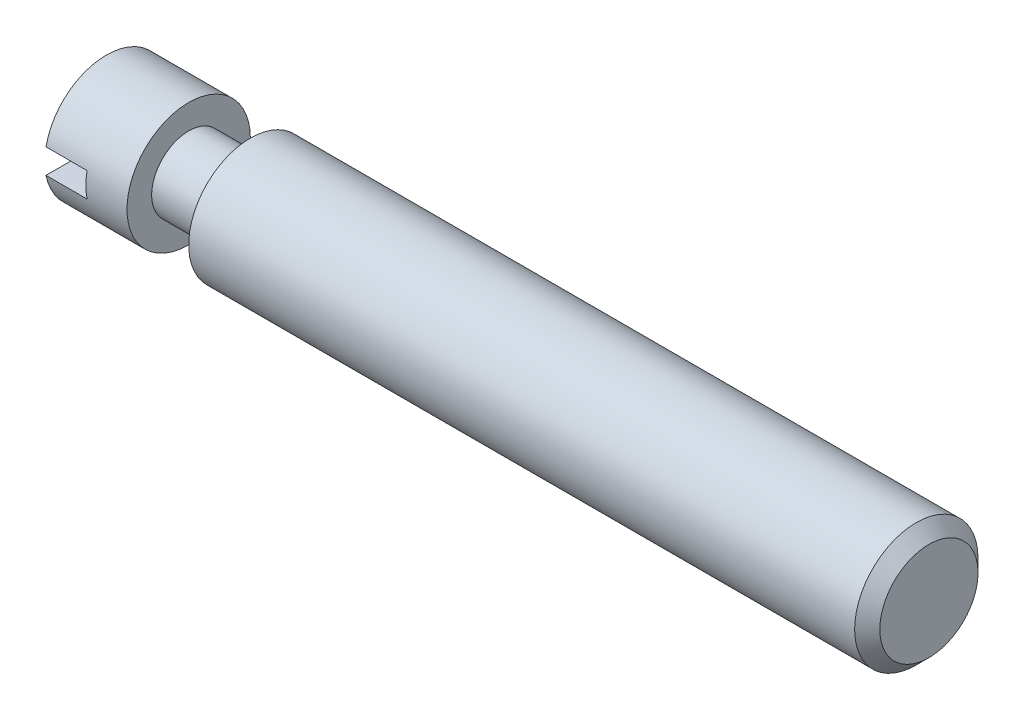
ISO-10303-21;
HEADER;
FILE_DESCRIPTION(('STEP AP214'),'2;1');
FILE_NAME('part.step','',(''),(''),'','','');
FILE_SCHEMA(('AUTOMOTIVE_DESIGN { 1 0 10303 214 1 1 1 1 }'));
ENDSEC;
DATA;
#1=APPLICATION_CONTEXT('core data for automotive mechanical design processes');
#2=APPLICATION_PROTOCOL_DEFINITION('international standard','automotive_design',2000,#1);
#3=PRODUCT_CONTEXT('',#1,'mechanical');
#4=PRODUCT('Part','Part','',(#3));
#5=PRODUCT_RELATED_PRODUCT_CATEGORY('part','',(#4));
#6=PRODUCT_DEFINITION_FORMATION('','',#4);
#7=PRODUCT_DEFINITION_CONTEXT('part definition',#1,'design');
#8=PRODUCT_DEFINITION('design','',#6,#7);
#9=PRODUCT_DEFINITION_SHAPE('','',#8);
#10=(LENGTH_UNIT() NAMED_UNIT(*) SI_UNIT(.MILLI.,.METRE.));
#11=(NAMED_UNIT(*) PLANE_ANGLE_UNIT() SI_UNIT($,.RADIAN.));
#12=(NAMED_UNIT(*) SI_UNIT($,.STERADIAN.) SOLID_ANGLE_UNIT());
#13=UNCERTAINTY_MEASURE_WITH_UNIT(LENGTH_MEASURE(1.E-05),#10,'distance_accuracy_value','');
#14=(GEOMETRIC_REPRESENTATION_CONTEXT(3) GLOBAL_UNCERTAINTY_ASSIGNED_CONTEXT((#13)) GLOBAL_UNIT_ASSIGNED_CONTEXT((#10,
#11,#12)) REPRESENTATION_CONTEXT('',''));
#15=CARTESIAN_POINT('',(0.,0.,0.));
#16=DIRECTION('',(0.,0.,1.));
#17=DIRECTION('',(1.,0.,0.));
#18=AXIS2_PLACEMENT_3D('',#15,#16,#17);
#19=CARTESIAN_POINT('',(2.,-0.6,3.));
#20=DIRECTION('',(1.,0.,0.));
#21=DIRECTION('',(0.,0.,-1.));
#22=AXIS2_PLACEMENT_3D('',#19,#20,#21);
#23=PLANE('',#22);
#24=DIRECTION('',(0.,0.,-1.));
#25=VECTOR('',#24,1.);
#26=CARTESIAN_POINT('',(2.,-0.6,3.));
#27=LINE('',#26,#25);
#28=CARTESIAN_POINT('',(2.,-0.6,-2.93938769133981));
#29=VERTEX_POINT('',#28);
#30=CARTESIAN_POINT('',(2.,-0.6,2.93938769133981));
#31=VERTEX_POINT('',#30);
#32=EDGE_CURVE('E60',#29,#31,#27,.F.);
#33=ORIENTED_EDGE('',*,*,#32,.T.);
#34=CARTESIAN_POINT('',(2.,0.,0.));
#35=DIRECTION('',(1.,0.,0.));
#36=DIRECTION('',(0.,0.,-1.));
#37=AXIS2_PLACEMENT_3D('',#34,#35,#36);
#38=CIRCLE('',#37,3.);
#39=CARTESIAN_POINT('',(2.,0.6,2.93938769133981));
#40=VERTEX_POINT('',#39);
#41=EDGE_CURVE('E19',#40,#31,#38,.T.);
#42=ORIENTED_EDGE('',*,*,#41,.F.);
#43=DIRECTION('',(0.,0.,1.));
#44=VECTOR('',#43,1.);
#45=CARTESIAN_POINT('',(2.,0.6,3.));
#46=LINE('',#45,#44);
#47=CARTESIAN_POINT('',(2.,0.600000000000001,-2.93938769133981));
#48=VERTEX_POINT('',#47);
#49=EDGE_CURVE('E57',#40,#48,#46,.F.);
#50=ORIENTED_EDGE('',*,*,#49,.T.);
#51=CARTESIAN_POINT('',(2.,0.,0.));
#52=DIRECTION('',(1.,0.,0.));
#53=DIRECTION('',(0.,0.,-1.));
#54=AXIS2_PLACEMENT_3D('',#51,#52,#53);
#55=CIRCLE('',#54,3.);
#56=EDGE_CURVE('E64',#29,#48,#55,.T.);
#57=ORIENTED_EDGE('',*,*,#56,.F.);
#58=EDGE_LOOP('',(#33,#42,#50,#57));
#59=FACE_BOUND('',#58,.T.);
#60=ADVANCED_FACE('F16',(#59),#23,.F.);
#61=CARTESIAN_POINT('',(0.,1.5,0.));
#62=DIRECTION('',(-1.,0.,0.));
#63=DIRECTION('',(0.,0.,1.));
#64=AXIS2_PLACEMENT_3D('',#61,#62,#63);
#65=PLANE('',#64);
#66=CARTESIAN_POINT('',(0.,0.,0.));
#67=DIRECTION('',(1.,0.,0.));
#68=DIRECTION('',(0.,0.,-1.));
#69=AXIS2_PLACEMENT_3D('',#66,#67,#68);
#70=CIRCLE('',#69,3.);
#71=CARTESIAN_POINT('',(0.,0.600000000000001,-2.93938769133981));
#72=VERTEX_POINT('',#71);
#73=CARTESIAN_POINT('',(0.,0.6,2.93938769133981));
#74=VERTEX_POINT('',#73);
#75=EDGE_CURVE('E77',#72,#74,#70,.T.);
#76=ORIENTED_EDGE('',*,*,#75,.F.);
#77=DIRECTION('',(0.,0.,1.));
#78=VECTOR('',#77,1.);
#79=CARTESIAN_POINT('',(0.,0.6,3.));
#80=LINE('',#79,#78);
#81=EDGE_CURVE('E73',#72,#74,#80,.T.);
#82=ORIENTED_EDGE('',*,*,#81,.T.);
#83=EDGE_LOOP('',(#76,#82));
#84=FACE_BOUND('',#83,.T.);
#85=ADVANCED_FACE('F204',(#84),#65,.T.);
#86=CARTESIAN_POINT('',(2.,0.6,3.));
#87=DIRECTION('',(0.,1.,0.));
#88=DIRECTION('',(0.,0.,1.));
#89=AXIS2_PLACEMENT_3D('',#86,#87,#88);
#90=PLANE('',#89);
#91=ORIENTED_EDGE('',*,*,#49,.F.);
#92=DIRECTION('',(1.,0.,0.));
#93=VECTOR('',#92,1.);
#94=CARTESIAN_POINT('',(19.69325,0.600000000000001,2.93938769133981));
#95=LINE('',#94,#93);
#96=EDGE_CURVE('E69',#74,#40,#95,.T.);
#97=ORIENTED_EDGE('',*,*,#96,.F.);
#98=ORIENTED_EDGE('',*,*,#81,.F.);
#99=DIRECTION('',(1.,0.,0.));
#100=VECTOR('',#99,1.);
#101=CARTESIAN_POINT('',(19.69325,0.600000000000001,-2.93938769133981));
#102=LINE('',#101,#100);
#103=EDGE_CURVE('E72',#48,#72,#102,.F.);
#104=ORIENTED_EDGE('',*,*,#103,.F.);
#105=EDGE_LOOP('',(#91,#97,#98,#104));
#106=FACE_BOUND('',#105,.T.);
#107=ADVANCED_FACE('F67',(#106),#90,.F.);
#108=CARTESIAN_POINT('',(0.,-0.6,3.));
#109=DIRECTION('',(0.,-1.,0.));
#110=DIRECTION('',(0.,0.,-1.));
#111=AXIS2_PLACEMENT_3D('',#108,#109,#110);
#112=PLANE('',#111);
#113=DIRECTION('',(0.,0.,1.));
#114=VECTOR('',#113,1.);
#115=CARTESIAN_POINT('',(0.,-0.6,0.));
#116=LINE('',#115,#114);
#117=CARTESIAN_POINT('',(0.,-0.6,2.93938769133981));
#118=VERTEX_POINT('',#117);
#119=CARTESIAN_POINT('',(0.,-0.6,-2.93938769133981));
#120=VERTEX_POINT('',#119);
#121=EDGE_CURVE('E33',#118,#120,#116,.F.);
#122=ORIENTED_EDGE('',*,*,#121,.F.);
#123=DIRECTION('',(1.,0.,0.));
#124=VECTOR('',#123,1.);
#125=CARTESIAN_POINT('',(19.69325,-0.6,2.93938769133981));
#126=LINE('',#125,#124);
#127=EDGE_CURVE('E78',#31,#118,#126,.F.);
#128=ORIENTED_EDGE('',*,*,#127,.F.);
#129=ORIENTED_EDGE('',*,*,#32,.F.);
#130=DIRECTION('',(1.,0.,0.));
#131=VECTOR('',#130,1.);
#132=CARTESIAN_POINT('',(19.69325,-0.600000000000001,-2.93938769133981));
#133=LINE('',#132,#131);
#134=EDGE_CURVE('E86',#120,#29,#133,.T.);
#135=ORIENTED_EDGE('',*,*,#134,.F.);
#136=EDGE_LOOP('',(#122,#128,#129,#135));
#137=FACE_BOUND('',#136,.T.);
#138=ADVANCED_FACE('F102',(#137),#112,.F.);
#139=CARTESIAN_POINT('',(0.,1.5,0.));
#140=DIRECTION('',(-1.,0.,0.));
#141=DIRECTION('',(0.,0.,1.));
#142=AXIS2_PLACEMENT_3D('',#139,#140,#141);
#143=PLANE('',#142);
#144=ORIENTED_EDGE('',*,*,#121,.T.);
#145=CARTESIAN_POINT('',(0.,0.,0.));
#146=DIRECTION('',(1.,0.,0.));
#147=DIRECTION('',(0.,0.,-1.));
#148=AXIS2_PLACEMENT_3D('',#145,#146,#147);
#149=CIRCLE('',#148,3.);
#150=EDGE_CURVE('E80',#118,#120,#149,.T.);
#151=ORIENTED_EDGE('',*,*,#150,.F.);
#152=EDGE_LOOP('',(#144,#151));
#153=FACE_BOUND('',#152,.T.);
#154=ADVANCED_FACE('F179',(#153),#143,.T.);
#155=CARTESIAN_POINT('',(19.69325,0.,0.));
#156=DIRECTION('',(1.,0.,0.));
#157=DIRECTION('',(0.,0.,-1.));
#158=AXIS2_PLACEMENT_3D('',#155,#156,#157);
#159=CYLINDRICAL_SURFACE('',#158,3.);
#160=ORIENTED_EDGE('',*,*,#103,.T.);
#161=ORIENTED_EDGE('',*,*,#75,.T.);
#162=ORIENTED_EDGE('',*,*,#96,.T.);
#163=ORIENTED_EDGE('',*,*,#41,.T.);
#164=ORIENTED_EDGE('',*,*,#127,.T.);
#165=ORIENTED_EDGE('',*,*,#150,.T.);
#166=ORIENTED_EDGE('',*,*,#134,.T.);
#167=ORIENTED_EDGE('',*,*,#56,.T.);
#168=EDGE_LOOP('',(#160,#161,#162,#163,#164,#165,#166,#167));
#169=FACE_BOUND('',#168,.T.);
#170=CARTESIAN_POINT('',(4.,0.,0.));
#171=DIRECTION('',(1.,0.,0.));
#172=DIRECTION('',(0.,0.,-1.));
#173=AXIS2_PLACEMENT_3D('',#170,#171,#172);
#174=CIRCLE('',#173,3.);
#175=CARTESIAN_POINT('',(4.,0.,-3.));
#176=VERTEX_POINT('',#175);
#177=EDGE_CURVE('E99',#176,#176,#174,.F.);
#178=ORIENTED_EDGE('',*,*,#177,.T.);
#179=EDGE_LOOP('',(#178));
#180=FACE_BOUND('',#179,.T.);
#181=ADVANCED_FACE('F75',(#169,#180),#159,.T.);
#182=CARTESIAN_POINT('',(4.,3.3,0.));
#183=DIRECTION('',(-1.,0.,0.));
#184=DIRECTION('',(0.,0.,1.));
#185=AXIS2_PLACEMENT_3D('',#182,#183,#184);
#186=PLANE('',#185);
#187=CARTESIAN_POINT('',(4.,0.,0.));
#188=DIRECTION('',(1.,0.,0.));
#189=DIRECTION('',(0.,0.,-1.));
#190=AXIS2_PLACEMENT_3D('',#187,#188,#189);
#191=CIRCLE('',#190,1.8);
#192=CARTESIAN_POINT('',(4.,0.,-1.8));
#193=VERTEX_POINT('',#192);
#194=EDGE_CURVE('E96',#193,#193,#191,.T.);
#195=ORIENTED_EDGE('',*,*,#194,.F.);
#196=EDGE_LOOP('',(#195));
#197=FACE_BOUND('',#196,.T.);
#198=ORIENTED_EDGE('',*,*,#177,.F.);
#199=EDGE_LOOP('',(#198));
#200=FACE_BOUND('',#199,.T.);
#201=ADVANCED_FACE('F160',(#197,#200),#186,.F.);
#202=CARTESIAN_POINT('',(40.,1.19325,0.));
#203=DIRECTION('',(1.,0.,0.));
#204=DIRECTION('',(0.,0.,-1.));
#205=AXIS2_PLACEMENT_3D('',#202,#203,#204);
#206=PLANE('',#205);
#207=CARTESIAN_POINT('',(39.9999999999636,0.,0.));
#208=DIRECTION('',(-1.,0.,0.));
#209=DIRECTION('',(0.,0.,1.));
#210=AXIS2_PLACEMENT_3D('',#207,#208,#209);
#211=CIRCLE('',#210,2.38650000000007);
#212=CARTESIAN_POINT('',(39.9999999999636,0.,2.38650000000007));
#213=VERTEX_POINT('',#212);
#214=EDGE_CURVE('E93',#213,#213,#211,.T.);
#215=ORIENTED_EDGE('',*,*,#214,.F.);
#216=EDGE_LOOP('',(#215));
#217=FACE_BOUND('',#216,.T.);
#218=ADVANCED_FACE('F125',(#217),#206,.T.);
#219=CARTESIAN_POINT('',(5.5,0.,0.));
#220=DIRECTION('',(1.,0.,0.));
#221=DIRECTION('',(0.,0.,-1.));
#222=AXIS2_PLACEMENT_3D('',#219,#220,#221);
#223=CYLINDRICAL_SURFACE('',#222,1.8);
#224=CARTESIAN_POINT('',(7.,0.,0.));
#225=DIRECTION('',(1.,0.,0.));
#226=DIRECTION('',(0.,0.,-1.));
#227=AXIS2_PLACEMENT_3D('',#224,#225,#226);
#228=CIRCLE('',#227,1.8);
#229=CARTESIAN_POINT('',(7.,0.,-1.8));
#230=VERTEX_POINT('',#229);
#231=EDGE_CURVE('E90',#230,#230,#228,.F.);
#232=ORIENTED_EDGE('',*,*,#231,.T.);
#233=EDGE_LOOP('',(#232));
#234=FACE_BOUND('',#233,.T.);
#235=ORIENTED_EDGE('',*,*,#194,.T.);
#236=EDGE_LOOP('',(#235));
#237=FACE_BOUND('',#236,.T.);
#238=ADVANCED_FACE('F115',(#234,#237),#223,.T.);
#239=CARTESIAN_POINT('',(39.3865000000346,0.,0.));
#240=DIRECTION('',(-1.,0.,0.));
#241=DIRECTION('',(0.,0.,1.));
#242=AXIS2_PLACEMENT_3D('',#239,#240,#241);
#243=CONICAL_SURFACE('',#242,2.9999999999859,0.785398163443775);
#244=ORIENTED_EDGE('',*,*,#214,.T.);
#245=EDGE_LOOP('',(#244));
#246=FACE_BOUND('',#245,.T.);
#247=CARTESIAN_POINT('',(39.3865,0.,0.));
#248=DIRECTION('',(1.,0.,0.));
#249=DIRECTION('',(0.,0.,-1.));
#250=AXIS2_PLACEMENT_3D('',#247,#248,#249);
#251=CIRCLE('',#250,3.);
#252=CARTESIAN_POINT('',(39.3865,0.,-3.));
#253=VERTEX_POINT('',#252);
#254=EDGE_CURVE('E25',#253,#253,#251,.F.);
#255=ORIENTED_EDGE('',*,*,#254,.F.);
#256=EDGE_LOOP('',(#255));
#257=FACE_BOUND('',#256,.T.);
#258=ADVANCED_FACE('F112',(#246,#257),#243,.T.);
#259=CARTESIAN_POINT('',(7.,3.3,0.));
#260=DIRECTION('',(1.,0.,0.));
#261=DIRECTION('',(0.,0.,-1.));
#262=AXIS2_PLACEMENT_3D('',#259,#260,#261);
#263=PLANE('',#262);
#264=ORIENTED_EDGE('',*,*,#231,.F.);
#265=EDGE_LOOP('',(#264));
#266=FACE_BOUND('',#265,.T.);
#267=CARTESIAN_POINT('',(7.,0.,0.));
#268=DIRECTION('',(1.,0.,0.));
#269=DIRECTION('',(0.,0.,-1.));
#270=AXIS2_PLACEMENT_3D('',#267,#268,#269);
#271=CIRCLE('',#270,3.);
#272=CARTESIAN_POINT('',(7.,0.,-3.));
#273=VERTEX_POINT('',#272);
#274=EDGE_CURVE('E11',#273,#273,#271,.T.);
#275=ORIENTED_EDGE('',*,*,#274,.F.);
#276=EDGE_LOOP('',(#275));
#277=FACE_BOUND('',#276,.T.);
#278=ADVANCED_FACE('F114',(#266,#277),#263,.F.);
#279=CARTESIAN_POINT('',(19.69325,0.,0.));
#280=DIRECTION('',(1.,0.,0.));
#281=DIRECTION('',(0.,0.,-1.));
#282=AXIS2_PLACEMENT_3D('',#279,#280,#281);
#283=CYLINDRICAL_SURFACE('',#282,3.);
#284=ORIENTED_EDGE('',*,*,#254,.T.);
#285=EDGE_LOOP('',(#284));
#286=FACE_BOUND('',#285,.T.);
#287=ORIENTED_EDGE('',*,*,#274,.T.);
#288=EDGE_LOOP('',(#287));
#289=FACE_BOUND('',#288,.T.);
#290=ADVANCED_FACE('F109',(#286,#289),#283,.T.);
#291=CLOSED_SHELL('',(#60,#85,#107,#138,#154,#181,#201,#218,#238,#258,#278,#290));
#292=MANIFOLD_SOLID_BREP('B1',#291);
#293=ADVANCED_BREP_SHAPE_REPRESENTATION('',(#18,#292),#14);
#294=SHAPE_DEFINITION_REPRESENTATION(#9,#293);
ENDSEC;
END-ISO-10303-21;
